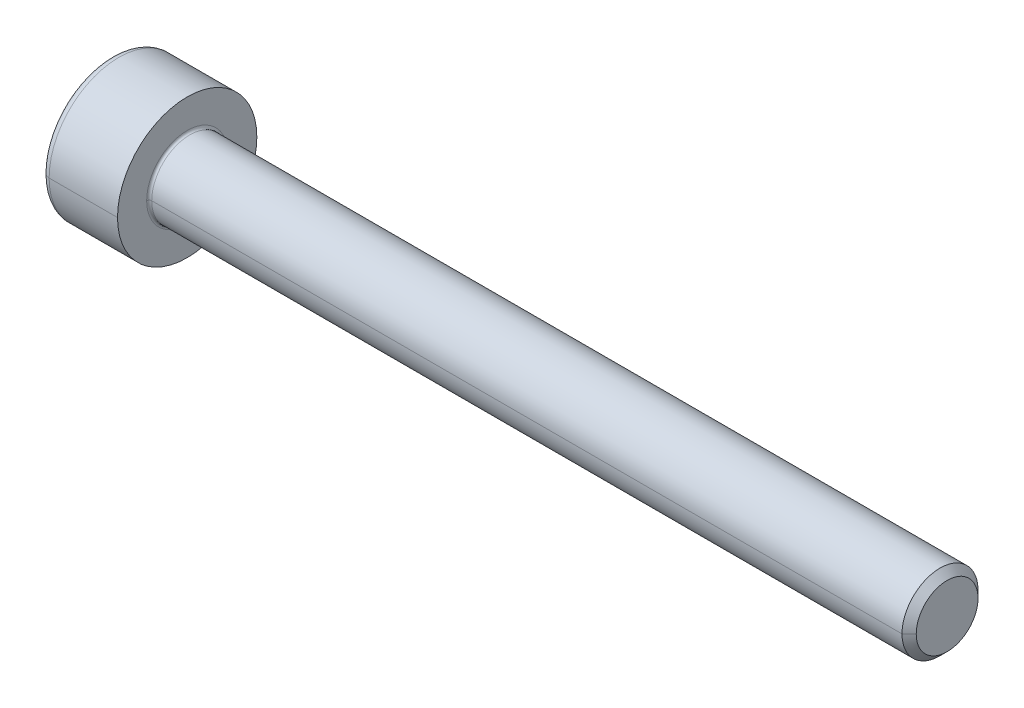
ISO-10303-21;
HEADER;
FILE_DESCRIPTION(('STEP AP214'),'2;1');
FILE_NAME('part.step','',(''),(''),'','','');
FILE_SCHEMA(('AUTOMOTIVE_DESIGN { 1 0 10303 214 1 1 1 1 }'));
ENDSEC;
DATA;
#1=APPLICATION_CONTEXT('core data for automotive mechanical design processes');
#2=APPLICATION_PROTOCOL_DEFINITION('international standard','automotive_design',2000,#1);
#3=PRODUCT_CONTEXT('',#1,'mechanical');
#4=PRODUCT('Part','Part','',(#3));
#5=PRODUCT_RELATED_PRODUCT_CATEGORY('part','',(#4));
#6=PRODUCT_DEFINITION_FORMATION('','',#4);
#7=PRODUCT_DEFINITION_CONTEXT('part definition',#1,'design');
#8=PRODUCT_DEFINITION('design','',#6,#7);
#9=PRODUCT_DEFINITION_SHAPE('','',#8);
#10=(LENGTH_UNIT() NAMED_UNIT(*) SI_UNIT(.MILLI.,.METRE.));
#11=(NAMED_UNIT(*) PLANE_ANGLE_UNIT() SI_UNIT($,.RADIAN.));
#12=(NAMED_UNIT(*) SI_UNIT($,.STERADIAN.) SOLID_ANGLE_UNIT());
#13=UNCERTAINTY_MEASURE_WITH_UNIT(LENGTH_MEASURE(1.E-05),#10,'distance_accuracy_value','');
#14=(GEOMETRIC_REPRESENTATION_CONTEXT(3) GLOBAL_UNCERTAINTY_ASSIGNED_CONTEXT((#13)) GLOBAL_UNIT_ASSIGNED_CONTEXT((#10,
#11,#12)) REPRESENTATION_CONTEXT('',''));
#15=CARTESIAN_POINT('',(0.,0.,0.));
#16=DIRECTION('',(0.,0.,1.));
#17=DIRECTION('',(1.,0.,0.));
#18=AXIS2_PLACEMENT_3D('',#15,#16,#17);
#19=CARTESIAN_POINT('',(1.3,0.,0.));
#20=DIRECTION('',(-1.,0.,0.));
#21=DIRECTION('',(0.,0.,1.));
#22=AXIS2_PLACEMENT_3D('',#19,#20,#21);
#23=CONICAL_SURFACE('',#22,1.26,1.0471975511966);
#24=DIRECTION('',(-0.5,0.,-0.866025403784436));
#25=VECTOR('',#24,1.);
#26=CARTESIAN_POINT('',(1.3,0.,-1.26));
#27=LINE('',#26,#25);
#28=CARTESIAN_POINT('',(2.02746133917893,0.,0.));
#29=VERTEX_POINT('',#28);
#30=CARTESIAN_POINT('',(1.3,0.,-1.26));
#31=VERTEX_POINT('',#30);
#32=EDGE_CURVE('E172',#29,#31,#27,.T.);
#33=ORIENTED_EDGE('',*,*,#32,.F.);
#34=DIRECTION('',(-0.5,0.,0.866025403784436));
#35=VECTOR('',#34,1.);
#36=CARTESIAN_POINT('',(1.3,0.,1.26));
#37=LINE('',#36,#35);
#38=CARTESIAN_POINT('',(1.3,0.,1.26));
#39=VERTEX_POINT('',#38);
#40=EDGE_CURVE('E175',#29,#39,#37,.T.);
#41=ORIENTED_EDGE('',*,*,#40,.T.);
#42=CARTESIAN_POINT('',(1.3,0.,0.));
#43=DIRECTION('',(-1.,0.,0.));
#44=DIRECTION('',(0.,0.,1.));
#45=AXIS2_PLACEMENT_3D('',#42,#43,#44);
#46=CIRCLE('',#45,1.26);
#47=CARTESIAN_POINT('',(1.3,1.09119200876839,0.63));
#48=VERTEX_POINT('',#47);
#49=EDGE_CURVE('E359',#39,#48,#46,.T.);
#50=ORIENTED_EDGE('',*,*,#49,.T.);
#51=CARTESIAN_POINT('',(1.3,0.,0.));
#52=DIRECTION('',(-1.,0.,0.));
#53=DIRECTION('',(0.,0.,1.));
#54=AXIS2_PLACEMENT_3D('',#51,#52,#53);
#55=CIRCLE('',#54,1.26);
#56=CARTESIAN_POINT('',(1.3,1.09119200876839,-0.63));
#57=VERTEX_POINT('',#56);
#58=EDGE_CURVE('E25',#48,#57,#55,.T.);
#59=ORIENTED_EDGE('',*,*,#58,.T.);
#60=CARTESIAN_POINT('',(1.3,0.,0.));
#61=DIRECTION('',(-1.,0.,0.));
#62=DIRECTION('',(0.,0.,1.));
#63=AXIS2_PLACEMENT_3D('',#60,#61,#62);
#64=CIRCLE('',#63,1.26);
#65=EDGE_CURVE('E11',#57,#31,#64,.T.);
#66=ORIENTED_EDGE('',*,*,#65,.T.);
#67=EDGE_LOOP('',(#33,#41,#50,#59,#66));
#68=FACE_BOUND('',#67,.T.);
#69=ADVANCED_FACE('F17',(#68),#23,.F.);
#70=CARTESIAN_POINT('',(1.3,1.45492267835785,0.));
#71=DIRECTION('',(1.,0.,0.));
#72=DIRECTION('',(0.,1.,0.));
#73=AXIS2_PLACEMENT_3D('',#70,#71,#72);
#74=PLANE('',#73);
#75=DIRECTION('',(0.,-0.5,-0.866025403784438));
#76=VECTOR('',#75,1.);
#77=CARTESIAN_POINT('',(1.3,1.45492267835785,0.));
#78=LINE('',#77,#76);
#79=CARTESIAN_POINT('',(1.3,0.727461339178922,-1.26));
#80=VERTEX_POINT('',#79);
#81=EDGE_CURVE('E43',#57,#80,#78,.T.);
#82=ORIENTED_EDGE('',*,*,#81,.T.);
#83=DIRECTION('',(0.,-1.,0.));
#84=VECTOR('',#83,1.);
#85=CARTESIAN_POINT('',(1.3,0.727461339178922,-1.26));
#86=LINE('',#85,#84);
#87=EDGE_CURVE('E288',#80,#31,#86,.T.);
#88=ORIENTED_EDGE('',*,*,#87,.T.);
#89=ORIENTED_EDGE('',*,*,#65,.F.);
#90=EDGE_LOOP('',(#82,#88,#89));
#91=FACE_BOUND('',#90,.T.);
#92=ADVANCED_FACE('F380',(#91),#74,.F.);
#93=CARTESIAN_POINT('',(1.3,1.45492267835785,0.));
#94=DIRECTION('',(1.,0.,0.));
#95=DIRECTION('',(0.,1.,0.));
#96=AXIS2_PLACEMENT_3D('',#93,#94,#95);
#97=PLANE('',#96);
#98=DIRECTION('',(0.,-0.5,0.866025403784439));
#99=VECTOR('',#98,1.);
#100=CARTESIAN_POINT('',(1.3,1.45492267835785,0.));
#101=LINE('',#100,#99);
#102=CARTESIAN_POINT('',(1.3,1.45492267835785,0.));
#103=VERTEX_POINT('',#102);
#104=EDGE_CURVE('E313',#103,#48,#101,.T.);
#105=ORIENTED_EDGE('',*,*,#104,.F.);
#106=DIRECTION('',(0.,-0.5,-0.866025403784438));
#107=VECTOR('',#106,1.);
#108=CARTESIAN_POINT('',(1.3,1.45492267835785,0.));
#109=LINE('',#108,#107);
#110=EDGE_CURVE('E228',#103,#57,#109,.T.);
#111=ORIENTED_EDGE('',*,*,#110,.T.);
#112=ORIENTED_EDGE('',*,*,#58,.F.);
#113=EDGE_LOOP('',(#105,#111,#112));
#114=FACE_BOUND('',#113,.T.);
#115=ADVANCED_FACE('F367',(#114),#97,.F.);
#116=CARTESIAN_POINT('',(1.3,1.45492267835785,0.));
#117=DIRECTION('',(1.,0.,0.));
#118=DIRECTION('',(0.,1.,0.));
#119=AXIS2_PLACEMENT_3D('',#116,#117,#118);
#120=PLANE('',#119);
#121=DIRECTION('',(0.,1.,0.));
#122=VECTOR('',#121,1.);
#123=CARTESIAN_POINT('',(1.3,-0.727461339178933,1.26));
#124=LINE('',#123,#122);
#125=CARTESIAN_POINT('',(1.3,0.727461339178925,1.26));
#126=VERTEX_POINT('',#125);
#127=EDGE_CURVE('E324',#39,#126,#124,.T.);
#128=ORIENTED_EDGE('',*,*,#127,.T.);
#129=DIRECTION('',(0.,-0.5,0.866025403784439));
#130=VECTOR('',#129,1.);
#131=CARTESIAN_POINT('',(1.3,1.45492267835785,0.));
#132=LINE('',#131,#130);
#133=EDGE_CURVE('E317',#48,#126,#132,.T.);
#134=ORIENTED_EDGE('',*,*,#133,.F.);
#135=ORIENTED_EDGE('',*,*,#49,.F.);
#136=EDGE_LOOP('',(#128,#134,#135));
#137=FACE_BOUND('',#136,.T.);
#138=ADVANCED_FACE('F388',(#137),#120,.F.);
#139=CARTESIAN_POINT('',(1.3,1.45492267835785,0.));
#140=DIRECTION('',(1.,0.,0.));
#141=DIRECTION('',(0.,1.,0.));
#142=AXIS2_PLACEMENT_3D('',#139,#140,#141);
#143=PLANE('',#142);
#144=DIRECTION('',(0.,-0.5,-0.866025403784438));
#145=VECTOR('',#144,1.);
#146=CARTESIAN_POINT('',(1.3,-0.727461339178933,1.26));
#147=LINE('',#146,#145);
#148=CARTESIAN_POINT('',(1.3,-0.727461339178933,1.26));
#149=VERTEX_POINT('',#148);
#150=CARTESIAN_POINT('',(1.3,-1.0911920087684,0.63));
#151=VERTEX_POINT('',#150);
#152=EDGE_CURVE('E233',#149,#151,#147,.T.);
#153=ORIENTED_EDGE('',*,*,#152,.F.);
#154=DIRECTION('',(0.,1.,0.));
#155=VECTOR('',#154,1.);
#156=CARTESIAN_POINT('',(1.3,-0.727461339178933,1.26));
#157=LINE('',#156,#155);
#158=EDGE_CURVE('E234',#149,#39,#157,.T.);
#159=ORIENTED_EDGE('',*,*,#158,.T.);
#160=CARTESIAN_POINT('',(1.3,0.,0.));
#161=DIRECTION('',(-1.,0.,0.));
#162=DIRECTION('',(0.,0.,1.));
#163=AXIS2_PLACEMENT_3D('',#160,#161,#162);
#164=CIRCLE('',#163,1.26);
#165=EDGE_CURVE('E185',#151,#39,#164,.T.);
#166=ORIENTED_EDGE('',*,*,#165,.F.);
#167=EDGE_LOOP('',(#153,#159,#166));
#168=FACE_BOUND('',#167,.T.);
#169=ADVANCED_FACE('F423',(#168),#143,.F.);
#170=CARTESIAN_POINT('',(1.3,1.45492267835785,0.));
#171=DIRECTION('',(1.,0.,0.));
#172=DIRECTION('',(0.,1.,0.));
#173=AXIS2_PLACEMENT_3D('',#170,#171,#172);
#174=PLANE('',#173);
#175=DIRECTION('',(0.,0.5,-0.866025403784439));
#176=VECTOR('',#175,1.);
#177=CARTESIAN_POINT('',(1.3,-1.45492267835786,0.));
#178=LINE('',#177,#176);
#179=CARTESIAN_POINT('',(1.3,-1.45492267835786,0.));
#180=VERTEX_POINT('',#179);
#181=CARTESIAN_POINT('',(1.3,-1.0911920087684,-0.63));
#182=VERTEX_POINT('',#181);
#183=EDGE_CURVE('E345',#180,#182,#178,.T.);
#184=ORIENTED_EDGE('',*,*,#183,.F.);
#185=DIRECTION('',(0.,-0.5,-0.866025403784438));
#186=VECTOR('',#185,1.);
#187=CARTESIAN_POINT('',(1.3,-0.727461339178933,1.26));
#188=LINE('',#187,#186);
#189=EDGE_CURVE('E333',#151,#180,#188,.T.);
#190=ORIENTED_EDGE('',*,*,#189,.F.);
#191=CARTESIAN_POINT('',(1.3,0.,0.));
#192=DIRECTION('',(-1.,0.,0.));
#193=DIRECTION('',(0.,0.,1.));
#194=AXIS2_PLACEMENT_3D('',#191,#192,#193);
#195=CIRCLE('',#194,1.26);
#196=EDGE_CURVE('E209',#182,#151,#195,.T.);
#197=ORIENTED_EDGE('',*,*,#196,.F.);
#198=EDGE_LOOP('',(#184,#190,#197));
#199=FACE_BOUND('',#198,.T.);
#200=ADVANCED_FACE('F419',(#199),#174,.F.);
#201=CARTESIAN_POINT('',(1.3,1.45492267835785,0.));
#202=DIRECTION('',(1.,0.,0.));
#203=DIRECTION('',(0.,1.,0.));
#204=AXIS2_PLACEMENT_3D('',#201,#202,#203);
#205=PLANE('',#204);
#206=DIRECTION('',(0.,-1.,0.));
#207=VECTOR('',#206,1.);
#208=CARTESIAN_POINT('',(1.3,0.727461339178922,-1.26));
#209=LINE('',#208,#207);
#210=CARTESIAN_POINT('',(1.3,-0.727461339178936,-1.26));
#211=VERTEX_POINT('',#210);
#212=EDGE_CURVE('E337',#31,#211,#209,.T.);
#213=ORIENTED_EDGE('',*,*,#212,.T.);
#214=DIRECTION('',(0.,0.5,-0.866025403784439));
#215=VECTOR('',#214,1.);
#216=CARTESIAN_POINT('',(1.3,-1.45492267835786,0.));
#217=LINE('',#216,#215);
#218=EDGE_CURVE('E338',#182,#211,#217,.T.);
#219=ORIENTED_EDGE('',*,*,#218,.F.);
#220=CARTESIAN_POINT('',(1.3,0.,0.));
#221=DIRECTION('',(-1.,0.,0.));
#222=DIRECTION('',(0.,0.,1.));
#223=AXIS2_PLACEMENT_3D('',#220,#221,#222);
#224=CIRCLE('',#223,1.26);
#225=EDGE_CURVE('E179',#31,#182,#224,.T.);
#226=ORIENTED_EDGE('',*,*,#225,.F.);
#227=EDGE_LOOP('',(#213,#219,#226));
#228=FACE_BOUND('',#227,.T.);
#229=ADVANCED_FACE('F422',(#228),#205,.F.);
#230=CARTESIAN_POINT('',(1.3,1.45492267835785,0.));
#231=DIRECTION('',(0.,0.866025403784438,-0.5));
#232=DIRECTION('',(-1.,0.,0.));
#233=AXIS2_PLACEMENT_3D('',#230,#231,#232);
#234=PLANE('',#233);
#235=DIRECTION('',(0.,-0.5,-0.866025403784438));
#236=VECTOR('',#235,1.);
#237=CARTESIAN_POINT('',(0.,1.45492267835785,0.));
#238=LINE('',#237,#236);
#239=CARTESIAN_POINT('',(0.,1.45492267835785,0.));
#240=VERTEX_POINT('',#239);
#241=CARTESIAN_POINT('',(0.,0.727461339178922,-1.26));
#242=VERTEX_POINT('',#241);
#243=EDGE_CURVE('E294',#240,#242,#238,.T.);
#244=ORIENTED_EDGE('',*,*,#243,.T.);
#245=DIRECTION('',(-1.,0.,0.));
#246=VECTOR('',#245,1.);
#247=CARTESIAN_POINT('',(1.3,0.727461339178922,-1.26));
#248=LINE('',#247,#246);
#249=EDGE_CURVE('E229',#80,#242,#248,.T.);
#250=ORIENTED_EDGE('',*,*,#249,.F.);
#251=ORIENTED_EDGE('',*,*,#81,.F.);
#252=ORIENTED_EDGE('',*,*,#110,.F.);
#253=DIRECTION('',(-1.,0.,0.));
#254=VECTOR('',#253,1.);
#255=CARTESIAN_POINT('',(1.3,1.45492267835785,0.));
#256=LINE('',#255,#254);
#257=EDGE_CURVE('E310',#103,#240,#256,.T.);
#258=ORIENTED_EDGE('',*,*,#257,.T.);
#259=EDGE_LOOP('',(#244,#250,#251,#252,#258));
#260=FACE_BOUND('',#259,.T.);
#261=ADVANCED_FACE('F370',(#260),#234,.F.);
#262=CARTESIAN_POINT('',(1.3,0.727461339178922,-1.26));
#263=DIRECTION('',(0.,0.,-1.));
#264=DIRECTION('',(0.,-1.,0.));
#265=AXIS2_PLACEMENT_3D('',#262,#263,#264);
#266=PLANE('',#265);
#267=DIRECTION('',(0.,-1.,0.));
#268=VECTOR('',#267,1.);
#269=CARTESIAN_POINT('',(0.,0.727461339178922,-1.26));
#270=LINE('',#269,#268);
#271=CARTESIAN_POINT('',(0.,-0.727461339178936,-1.26));
#272=VERTEX_POINT('',#271);
#273=EDGE_CURVE('E293',#242,#272,#270,.T.);
#274=ORIENTED_EDGE('',*,*,#273,.T.);
#275=DIRECTION('',(-1.,0.,0.));
#276=VECTOR('',#275,1.);
#277=CARTESIAN_POINT('',(1.3,-0.727461339178936,-1.26));
#278=LINE('',#277,#276);
#279=EDGE_CURVE('E334',#211,#272,#278,.T.);
#280=ORIENTED_EDGE('',*,*,#279,.F.);
#281=ORIENTED_EDGE('',*,*,#212,.F.);
#282=ORIENTED_EDGE('',*,*,#87,.F.);
#283=ORIENTED_EDGE('',*,*,#249,.T.);
#284=EDGE_LOOP('',(#274,#280,#281,#282,#283));
#285=FACE_BOUND('',#284,.T.);
#286=ADVANCED_FACE('F377',(#285),#266,.F.);
#287=CARTESIAN_POINT('',(1.3,-1.45492267835786,0.));
#288=DIRECTION('',(0.,0.866025403784439,0.5));
#289=DIRECTION('',(1.,0.,0.));
#290=AXIS2_PLACEMENT_3D('',#287,#288,#289);
#291=PLANE('',#290);
#292=DIRECTION('',(0.,0.5,-0.866025403784439));
#293=VECTOR('',#292,1.);
#294=CARTESIAN_POINT('',(0.,-1.45492267835786,0.));
#295=LINE('',#294,#293);
#296=CARTESIAN_POINT('',(0.,-1.45492267835786,0.));
#297=VERTEX_POINT('',#296);
#298=EDGE_CURVE('E289',#297,#272,#295,.T.);
#299=ORIENTED_EDGE('',*,*,#298,.F.);
#300=DIRECTION('',(-1.,0.,0.));
#301=VECTOR('',#300,1.);
#302=CARTESIAN_POINT('',(1.3,-1.45492267835786,0.));
#303=LINE('',#302,#301);
#304=EDGE_CURVE('E342',#180,#297,#303,.T.);
#305=ORIENTED_EDGE('',*,*,#304,.F.);
#306=ORIENTED_EDGE('',*,*,#183,.T.);
#307=ORIENTED_EDGE('',*,*,#218,.T.);
#308=ORIENTED_EDGE('',*,*,#279,.T.);
#309=EDGE_LOOP('',(#299,#305,#306,#307,#308));
#310=FACE_BOUND('',#309,.T.);
#311=ADVANCED_FACE('F412',(#310),#291,.T.);
#312=CARTESIAN_POINT('',(1.3,-0.727461339178933,1.26));
#313=DIRECTION('',(0.,0.866025403784438,-0.5));
#314=DIRECTION('',(-1.,0.,0.));
#315=AXIS2_PLACEMENT_3D('',#312,#313,#314);
#316=PLANE('',#315);
#317=DIRECTION('',(0.,-0.5,-0.866025403784438));
#318=VECTOR('',#317,1.);
#319=CARTESIAN_POINT('',(0.,-0.727461339178933,1.26));
#320=LINE('',#319,#318);
#321=CARTESIAN_POINT('',(0.,-0.727461339178933,1.26));
#322=VERTEX_POINT('',#321);
#323=EDGE_CURVE('E199',#322,#297,#320,.T.);
#324=ORIENTED_EDGE('',*,*,#323,.F.);
#325=DIRECTION('',(-1.,0.,0.));
#326=VECTOR('',#325,1.);
#327=CARTESIAN_POINT('',(1.3,-0.727461339178933,1.26));
#328=LINE('',#327,#326);
#329=EDGE_CURVE('E230',#149,#322,#328,.T.);
#330=ORIENTED_EDGE('',*,*,#329,.F.);
#331=ORIENTED_EDGE('',*,*,#152,.T.);
#332=ORIENTED_EDGE('',*,*,#189,.T.);
#333=ORIENTED_EDGE('',*,*,#304,.T.);
#334=EDGE_LOOP('',(#324,#330,#331,#332,#333));
#335=FACE_BOUND('',#334,.T.);
#336=ADVANCED_FACE('F408',(#335),#316,.T.);
#337=CARTESIAN_POINT('',(1.3,-0.727461339178933,1.26));
#338=DIRECTION('',(0.,0.,1.));
#339=DIRECTION('',(0.,-1.,0.));
#340=AXIS2_PLACEMENT_3D('',#337,#338,#339);
#341=PLANE('',#340);
#342=DIRECTION('',(0.,1.,0.));
#343=VECTOR('',#342,1.);
#344=CARTESIAN_POINT('',(0.,-0.727461339178933,1.26));
#345=LINE('',#344,#343);
#346=CARTESIAN_POINT('',(0.,0.727461339178925,1.26));
#347=VERTEX_POINT('',#346);
#348=EDGE_CURVE('E195',#322,#347,#345,.T.);
#349=ORIENTED_EDGE('',*,*,#348,.T.);
#350=DIRECTION('',(-1.,0.,0.));
#351=VECTOR('',#350,1.);
#352=CARTESIAN_POINT('',(1.3,0.727461339178925,1.26));
#353=LINE('',#352,#351);
#354=EDGE_CURVE('E321',#126,#347,#353,.T.);
#355=ORIENTED_EDGE('',*,*,#354,.F.);
#356=ORIENTED_EDGE('',*,*,#127,.F.);
#357=ORIENTED_EDGE('',*,*,#158,.F.);
#358=ORIENTED_EDGE('',*,*,#329,.T.);
#359=EDGE_LOOP('',(#349,#355,#356,#357,#358));
#360=FACE_BOUND('',#359,.T.);
#361=ADVANCED_FACE('F405',(#360),#341,.F.);
#362=CARTESIAN_POINT('',(1.3,1.45492267835785,0.));
#363=DIRECTION('',(0.,-0.866025403784439,-0.5));
#364=DIRECTION('',(0.,0.5,-0.866025403784439));
#365=AXIS2_PLACEMENT_3D('',#362,#363,#364);
#366=PLANE('',#365);
#367=DIRECTION('',(0.,-0.5,0.866025403784439));
#368=VECTOR('',#367,1.);
#369=CARTESIAN_POINT('',(0.,1.45492267835785,0.));
#370=LINE('',#369,#368);
#371=EDGE_CURVE('E200',#240,#347,#370,.T.);
#372=ORIENTED_EDGE('',*,*,#371,.F.);
#373=ORIENTED_EDGE('',*,*,#257,.F.);
#374=ORIENTED_EDGE('',*,*,#104,.T.);
#375=ORIENTED_EDGE('',*,*,#133,.T.);
#376=ORIENTED_EDGE('',*,*,#354,.T.);
#377=EDGE_LOOP('',(#372,#373,#374,#375,#376));
#378=FACE_BOUND('',#377,.T.);
#379=ADVANCED_FACE('F391',(#378),#366,.T.);
#380=CARTESIAN_POINT('',(0.3,0.,0.));
#381=DIRECTION('',(-1.,0.,0.));
#382=DIRECTION('',(0.,0.,1.));
#383=AXIS2_PLACEMENT_3D('',#380,#381,#382);
#384=TOROIDAL_SURFACE('',#383,2.45,0.3);
#385=CARTESIAN_POINT('',(0.3,0.,-2.45));
#386=DIRECTION('',(0.,1.,0.));
#387=DIRECTION('',(0.,0.,1.));
#388=AXIS2_PLACEMENT_3D('',#385,#386,#387);
#389=CIRCLE('',#388,0.3);
#390=CARTESIAN_POINT('',(0.3,0.,-2.75));
#391=VERTEX_POINT('',#390);
#392=CARTESIAN_POINT('',(0.,0.,-2.45));
#393=VERTEX_POINT('',#392);
#394=EDGE_CURVE('E210',#391,#393,#389,.T.);
#395=ORIENTED_EDGE('',*,*,#394,.F.);
#396=CARTESIAN_POINT('',(0.3,0.,0.));
#397=DIRECTION('',(1.,0.,0.));
#398=DIRECTION('',(0.,0.,1.));
#399=AXIS2_PLACEMENT_3D('',#396,#397,#398);
#400=CIRCLE('',#399,2.75);
#401=CARTESIAN_POINT('',(0.3,0.,2.75));
#402=VERTEX_POINT('',#401);
#403=EDGE_CURVE('E301',#402,#391,#400,.T.);
#404=ORIENTED_EDGE('',*,*,#403,.F.);
#405=CARTESIAN_POINT('',(0.3,0.,2.45));
#406=DIRECTION('',(0.,-1.,0.));
#407=DIRECTION('',(0.,0.,-1.));
#408=AXIS2_PLACEMENT_3D('',#405,#406,#407);
#409=CIRCLE('',#408,0.3);
#410=CARTESIAN_POINT('',(0.,0.,2.45));
#411=VERTEX_POINT('',#410);
#412=EDGE_CURVE('E201',#402,#411,#409,.T.);
#413=ORIENTED_EDGE('',*,*,#412,.T.);
#414=CARTESIAN_POINT('',(0.,0.,0.));
#415=DIRECTION('',(-1.,0.,0.));
#416=DIRECTION('',(0.,0.,1.));
#417=AXIS2_PLACEMENT_3D('',#414,#415,#416);
#418=CIRCLE('',#417,2.45);
#419=EDGE_CURVE('E280',#393,#411,#418,.T.);
#420=ORIENTED_EDGE('',*,*,#419,.F.);
#421=EDGE_LOOP('',(#395,#404,#413,#420));
#422=FACE_BOUND('',#421,.T.);
#423=ADVANCED_FACE('F403',(#422),#384,.T.);
#424=CARTESIAN_POINT('',(3.1,0.,0.));
#425=DIRECTION('',(1.,0.,0.));
#426=DIRECTION('',(0.,0.,-1.));
#427=AXIS2_PLACEMENT_3D('',#424,#425,#426);
#428=TOROIDAL_SURFACE('',#427,1.6,0.1);
#429=CARTESIAN_POINT('',(3.1,0.,1.6));
#430=DIRECTION('',(0.,1.,0.));
#431=DIRECTION('',(0.,0.,1.));
#432=AXIS2_PLACEMENT_3D('',#429,#430,#431);
#433=CIRCLE('',#432,0.1);
#434=CARTESIAN_POINT('',(3.1,0.,1.5));
#435=VERTEX_POINT('',#434);
#436=CARTESIAN_POINT('',(3.,0.,1.6));
#437=VERTEX_POINT('',#436);
#438=EDGE_CURVE('E218',#435,#437,#433,.T.);
#439=ORIENTED_EDGE('',*,*,#438,.F.);
#440=CARTESIAN_POINT('',(3.1,0.,0.));
#441=DIRECTION('',(1.,0.,0.));
#442=DIRECTION('',(0.,0.,-1.));
#443=AXIS2_PLACEMENT_3D('',#440,#441,#442);
#444=CIRCLE('',#443,1.5);
#445=CARTESIAN_POINT('',(3.1,0.,-1.5));
#446=VERTEX_POINT('',#445);
#447=EDGE_CURVE('E261',#446,#435,#444,.T.);
#448=ORIENTED_EDGE('',*,*,#447,.F.);
#449=CARTESIAN_POINT('',(3.1,0.,-1.6));
#450=DIRECTION('',(0.,-1.,0.));
#451=DIRECTION('',(0.,0.,-1.));
#452=AXIS2_PLACEMENT_3D('',#449,#450,#451);
#453=CIRCLE('',#452,0.1);
#454=CARTESIAN_POINT('',(3.,0.,-1.6));
#455=VERTEX_POINT('',#454);
#456=EDGE_CURVE('E223',#446,#455,#453,.T.);
#457=ORIENTED_EDGE('',*,*,#456,.T.);
#458=CARTESIAN_POINT('',(3.,0.,0.));
#459=DIRECTION('',(-1.,0.,0.));
#460=DIRECTION('',(0.,0.,-1.));
#461=AXIS2_PLACEMENT_3D('',#458,#459,#460);
#462=CIRCLE('',#461,1.6);
#463=EDGE_CURVE('E192',#437,#455,#462,.T.);
#464=ORIENTED_EDGE('',*,*,#463,.F.);
#465=EDGE_LOOP('',(#439,#448,#457,#464));
#466=FACE_BOUND('',#465,.T.);
#467=ADVANCED_FACE('F399',(#466),#428,.F.);
#468=CARTESIAN_POINT('',(33.,1.2195,0.));
#469=DIRECTION('',(1.,0.,0.));
#470=DIRECTION('',(0.,1.,0.));
#471=AXIS2_PLACEMENT_3D('',#468,#469,#470);
#472=PLANE('',#471);
#473=CARTESIAN_POINT('',(33.,0.,0.));
#474=DIRECTION('',(-1.,0.,0.));
#475=DIRECTION('',(0.,0.,1.));
#476=AXIS2_PLACEMENT_3D('',#473,#474,#475);
#477=CIRCLE('',#476,1.2195);
#478=CARTESIAN_POINT('',(33.,0.,1.2195));
#479=VERTEX_POINT('',#478);
#480=CARTESIAN_POINT('',(33.,0.,-1.2195));
#481=VERTEX_POINT('',#480);
#482=EDGE_CURVE('E244',#479,#481,#477,.T.);
#483=ORIENTED_EDGE('',*,*,#482,.F.);
#484=CARTESIAN_POINT('',(33.,0.,0.));
#485=DIRECTION('',(-1.,0.,0.));
#486=DIRECTION('',(0.,0.,1.));
#487=AXIS2_PLACEMENT_3D('',#484,#485,#486);
#488=CIRCLE('',#487,1.2195);
#489=EDGE_CURVE('E307',#481,#479,#488,.T.);
#490=ORIENTED_EDGE('',*,*,#489,.F.);
#491=EDGE_LOOP('',(#483,#490));
#492=FACE_BOUND('',#491,.T.);
#493=ADVANCED_FACE('F402',(#492),#472,.T.);
#494=CARTESIAN_POINT('',(33.,0.,0.));
#495=DIRECTION('',(-1.,0.,0.));
#496=DIRECTION('',(0.,0.,1.));
#497=AXIS2_PLACEMENT_3D('',#494,#495,#496);
#498=CONICAL_SURFACE('',#497,1.2195,0.785398163397439);
#499=DIRECTION('',(-0.707106781186554,0.,-0.707106781186541));
#500=VECTOR('',#499,1.);
#501=CARTESIAN_POINT('',(33.,0.,-1.2195));
#502=LINE('',#501,#500);
#503=CARTESIAN_POINT('',(32.7195,0.,-1.5));
#504=VERTEX_POINT('',#503);
#505=EDGE_CURVE('E248',#481,#504,#502,.T.);
#506=ORIENTED_EDGE('',*,*,#505,.F.);
#507=ORIENTED_EDGE('',*,*,#489,.T.);
#508=DIRECTION('',(-0.707106781186554,0.,0.707106781186541));
#509=VECTOR('',#508,1.);
#510=CARTESIAN_POINT('',(33.,0.,1.2195));
#511=LINE('',#510,#509);
#512=CARTESIAN_POINT('',(32.7195,0.,1.5));
#513=VERTEX_POINT('',#512);
#514=EDGE_CURVE('E253',#479,#513,#511,.T.);
#515=ORIENTED_EDGE('',*,*,#514,.T.);
#516=CARTESIAN_POINT('',(32.7195,0.,0.));
#517=DIRECTION('',(-1.,0.,0.));
#518=DIRECTION('',(0.,0.,1.));
#519=AXIS2_PLACEMENT_3D('',#516,#517,#518);
#520=CIRCLE('',#519,1.5);
#521=EDGE_CURVE('E304',#504,#513,#520,.T.);
#522=ORIENTED_EDGE('',*,*,#521,.F.);
#523=EDGE_LOOP('',(#506,#507,#515,#522));
#524=FACE_BOUND('',#523,.T.);
#525=ADVANCED_FACE('F480',(#524),#498,.T.);
#526=CARTESIAN_POINT('',(-31.75,0.,0.));
#527=DIRECTION('',(-1.,0.,0.));
#528=DIRECTION('',(0.,0.,1.));
#529=AXIS2_PLACEMENT_3D('',#526,#527,#528);
#530=CYLINDRICAL_SURFACE('',#529,1.5);
#531=DIRECTION('',(-1.,0.,0.));
#532=VECTOR('',#531,1.);
#533=CARTESIAN_POINT('',(-31.75,0.,-1.5));
#534=LINE('',#533,#532);
#535=EDGE_CURVE('E257',#504,#446,#534,.T.);
#536=ORIENTED_EDGE('',*,*,#535,.F.);
#537=ORIENTED_EDGE('',*,*,#521,.T.);
#538=DIRECTION('',(-1.,0.,0.));
#539=VECTOR('',#538,1.);
#540=CARTESIAN_POINT('',(-31.75,0.,1.5));
#541=LINE('',#540,#539);
#542=EDGE_CURVE('E265',#513,#435,#541,.T.);
#543=ORIENTED_EDGE('',*,*,#542,.T.);
#544=CARTESIAN_POINT('',(3.1,0.,0.));
#545=DIRECTION('',(1.,0.,0.));
#546=DIRECTION('',(0.,0.,-1.));
#547=AXIS2_PLACEMENT_3D('',#544,#545,#546);
#548=CIRCLE('',#547,1.5);
#549=EDGE_CURVE('E205',#435,#446,#548,.T.);
#550=ORIENTED_EDGE('',*,*,#549,.T.);
#551=EDGE_LOOP('',(#536,#537,#543,#550));
#552=FACE_BOUND('',#551,.T.);
#553=ADVANCED_FACE('F397',(#552),#530,.T.);
#554=CARTESIAN_POINT('',(3.,2.75,0.));
#555=DIRECTION('',(1.,0.,0.));
#556=DIRECTION('',(0.,1.,0.));
#557=AXIS2_PLACEMENT_3D('',#554,#555,#556);
#558=PLANE('',#557);
#559=CARTESIAN_POINT('',(3.,0.,0.));
#560=DIRECTION('',(-1.,0.,0.));
#561=DIRECTION('',(0.,0.,-1.));
#562=AXIS2_PLACEMENT_3D('',#559,#560,#561);
#563=CIRCLE('',#562,1.6);
#564=EDGE_CURVE('E219',#455,#437,#563,.T.);
#565=ORIENTED_EDGE('',*,*,#564,.T.);
#566=ORIENTED_EDGE('',*,*,#463,.T.);
#567=EDGE_LOOP('',(#565,#566));
#568=FACE_BOUND('',#567,.T.);
#569=CARTESIAN_POINT('',(3.,0.,0.));
#570=DIRECTION('',(-1.,0.,0.));
#571=DIRECTION('',(0.,0.,1.));
#572=AXIS2_PLACEMENT_3D('',#569,#570,#571);
#573=CIRCLE('',#572,2.75);
#574=CARTESIAN_POINT('',(3.,0.,2.75));
#575=VERTEX_POINT('',#574);
#576=CARTESIAN_POINT('',(3.,0.,-2.75));
#577=VERTEX_POINT('',#576);
#578=EDGE_CURVE('E268',#575,#577,#573,.T.);
#579=ORIENTED_EDGE('',*,*,#578,.F.);
#580=CARTESIAN_POINT('',(3.,0.,0.));
#581=DIRECTION('',(-1.,0.,0.));
#582=DIRECTION('',(0.,0.,1.));
#583=AXIS2_PLACEMENT_3D('',#580,#581,#582);
#584=CIRCLE('',#583,2.75);
#585=EDGE_CURVE('E298',#577,#575,#584,.T.);
#586=ORIENTED_EDGE('',*,*,#585,.F.);
#587=EDGE_LOOP('',(#579,#586));
#588=FACE_BOUND('',#587,.T.);
#589=ADVANCED_FACE('F393',(#568,#588),#558,.T.);
#590=CARTESIAN_POINT('',(-31.75,0.,0.));
#591=DIRECTION('',(-1.,0.,0.));
#592=DIRECTION('',(0.,0.,1.));
#593=AXIS2_PLACEMENT_3D('',#590,#591,#592);
#594=CYLINDRICAL_SURFACE('',#593,2.75);
#595=DIRECTION('',(-1.,0.,0.));
#596=VECTOR('',#595,1.);
#597=CARTESIAN_POINT('',(-31.75,0.,-2.75));
#598=LINE('',#597,#596);
#599=EDGE_CURVE('E272',#577,#391,#598,.T.);
#600=ORIENTED_EDGE('',*,*,#599,.F.);
#601=ORIENTED_EDGE('',*,*,#585,.T.);
#602=DIRECTION('',(-1.,0.,0.));
#603=VECTOR('',#602,1.);
#604=CARTESIAN_POINT('',(-31.75,0.,2.75));
#605=LINE('',#604,#603);
#606=EDGE_CURVE('E276',#575,#402,#605,.T.);
#607=ORIENTED_EDGE('',*,*,#606,.T.);
#608=ORIENTED_EDGE('',*,*,#403,.T.);
#609=EDGE_LOOP('',(#600,#601,#607,#608));
#610=FACE_BOUND('',#609,.T.);
#611=ADVANCED_FACE('F396',(#610),#594,.T.);
#612=CARTESIAN_POINT('',(0.,0.,0.));
#613=DIRECTION('',(-1.,0.,0.));
#614=DIRECTION('',(0.,0.,1.));
#615=AXIS2_PLACEMENT_3D('',#612,#613,#614);
#616=PLANE('',#615);
#617=ORIENTED_EDGE('',*,*,#371,.T.);
#618=ORIENTED_EDGE('',*,*,#348,.F.);
#619=ORIENTED_EDGE('',*,*,#323,.T.);
#620=ORIENTED_EDGE('',*,*,#298,.T.);
#621=ORIENTED_EDGE('',*,*,#273,.F.);
#622=ORIENTED_EDGE('',*,*,#243,.F.);
#623=EDGE_LOOP('',(#617,#618,#619,#620,#621,#622));
#624=FACE_BOUND('',#623,.T.);
#625=CARTESIAN_POINT('',(0.,0.,0.));
#626=DIRECTION('',(-1.,0.,0.));
#627=DIRECTION('',(0.,0.,1.));
#628=AXIS2_PLACEMENT_3D('',#625,#626,#627);
#629=CIRCLE('',#628,2.45);
#630=EDGE_CURVE('E206',#411,#393,#629,.T.);
#631=ORIENTED_EDGE('',*,*,#630,.T.);
#632=ORIENTED_EDGE('',*,*,#419,.T.);
#633=EDGE_LOOP('',(#631,#632));
#634=FACE_BOUND('',#633,.T.);
#635=ADVANCED_FACE('F441',(#624,#634),#616,.T.);
#636=CARTESIAN_POINT('',(-31.75,0.,0.));
#637=DIRECTION('',(-1.,0.,0.));
#638=DIRECTION('',(0.,0.,1.));
#639=AXIS2_PLACEMENT_3D('',#636,#637,#638);
#640=CYLINDRICAL_SURFACE('',#639,2.75);
#641=ORIENTED_EDGE('',*,*,#578,.T.);
#642=ORIENTED_EDGE('',*,*,#599,.T.);
#643=CARTESIAN_POINT('',(0.3,0.,0.));
#644=DIRECTION('',(1.,0.,0.));
#645=DIRECTION('',(0.,0.,1.));
#646=AXIS2_PLACEMENT_3D('',#643,#644,#645);
#647=CIRCLE('',#646,2.75);
#648=EDGE_CURVE('E214',#391,#402,#647,.T.);
#649=ORIENTED_EDGE('',*,*,#648,.T.);
#650=ORIENTED_EDGE('',*,*,#606,.F.);
#651=EDGE_LOOP('',(#641,#642,#649,#650));
#652=FACE_BOUND('',#651,.T.);
#653=ADVANCED_FACE('F499',(#652),#640,.T.);
#654=CARTESIAN_POINT('',(-31.75,0.,0.));
#655=DIRECTION('',(-1.,0.,0.));
#656=DIRECTION('',(0.,0.,1.));
#657=AXIS2_PLACEMENT_3D('',#654,#655,#656);
#658=CYLINDRICAL_SURFACE('',#657,1.5);
#659=CARTESIAN_POINT('',(32.7195,0.,0.));
#660=DIRECTION('',(-1.,0.,0.));
#661=DIRECTION('',(0.,0.,1.));
#662=AXIS2_PLACEMENT_3D('',#659,#660,#661);
#663=CIRCLE('',#662,1.5);
#664=EDGE_CURVE('E252',#513,#504,#663,.T.);
#665=ORIENTED_EDGE('',*,*,#664,.T.);
#666=ORIENTED_EDGE('',*,*,#535,.T.);
#667=ORIENTED_EDGE('',*,*,#447,.T.);
#668=ORIENTED_EDGE('',*,*,#542,.F.);
#669=EDGE_LOOP('',(#665,#666,#667,#668));
#670=FACE_BOUND('',#669,.T.);
#671=ADVANCED_FACE('F492',(#670),#658,.T.);
#672=CARTESIAN_POINT('',(33.,0.,0.));
#673=DIRECTION('',(-1.,0.,0.));
#674=DIRECTION('',(0.,0.,1.));
#675=AXIS2_PLACEMENT_3D('',#672,#673,#674);
#676=CONICAL_SURFACE('',#675,1.2195,0.785398163397439);
#677=ORIENTED_EDGE('',*,*,#482,.T.);
#678=ORIENTED_EDGE('',*,*,#505,.T.);
#679=ORIENTED_EDGE('',*,*,#664,.F.);
#680=ORIENTED_EDGE('',*,*,#514,.F.);
#681=EDGE_LOOP('',(#677,#678,#679,#680));
#682=FACE_BOUND('',#681,.T.);
#683=ADVANCED_FACE('F488',(#682),#676,.T.);
#684=CARTESIAN_POINT('',(3.1,0.,0.));
#685=DIRECTION('',(1.,0.,0.));
#686=DIRECTION('',(0.,0.,-1.));
#687=AXIS2_PLACEMENT_3D('',#684,#685,#686);
#688=TOROIDAL_SURFACE('',#687,1.6,0.1);
#689=ORIENTED_EDGE('',*,*,#549,.F.);
#690=ORIENTED_EDGE('',*,*,#438,.T.);
#691=ORIENTED_EDGE('',*,*,#564,.F.);
#692=ORIENTED_EDGE('',*,*,#456,.F.);
#693=EDGE_LOOP('',(#689,#690,#691,#692));
#694=FACE_BOUND('',#693,.T.);
#695=ADVANCED_FACE('F484',(#694),#688,.F.);
#696=CARTESIAN_POINT('',(0.3,0.,0.));
#697=DIRECTION('',(-1.,0.,0.));
#698=DIRECTION('',(0.,0.,1.));
#699=AXIS2_PLACEMENT_3D('',#696,#697,#698);
#700=TOROIDAL_SURFACE('',#699,2.45,0.3);
#701=ORIENTED_EDGE('',*,*,#648,.F.);
#702=ORIENTED_EDGE('',*,*,#394,.T.);
#703=ORIENTED_EDGE('',*,*,#630,.F.);
#704=ORIENTED_EDGE('',*,*,#412,.F.);
#705=EDGE_LOOP('',(#701,#702,#703,#704));
#706=FACE_BOUND('',#705,.T.);
#707=ADVANCED_FACE('F477',(#706),#700,.T.);
#708=CARTESIAN_POINT('',(1.3,0.,0.));
#709=DIRECTION('',(-1.,0.,0.));
#710=DIRECTION('',(0.,0.,1.));
#711=AXIS2_PLACEMENT_3D('',#708,#709,#710);
#712=CONICAL_SURFACE('',#711,1.26,1.0471975511966);
#713=ORIENTED_EDGE('',*,*,#40,.F.);
#714=ORIENTED_EDGE('',*,*,#32,.T.);
#715=ORIENTED_EDGE('',*,*,#225,.T.);
#716=ORIENTED_EDGE('',*,*,#196,.T.);
#717=ORIENTED_EDGE('',*,*,#165,.T.);
#718=EDGE_LOOP('',(#713,#714,#715,#716,#717));
#719=FACE_BOUND('',#718,.T.);
#720=ADVANCED_FACE('F182',(#719),#712,.F.);
#721=CLOSED_SHELL('',(#69,#92,#115,#138,#169,#200,#229,#261,#286,#311,#336,#361,#379,#423,#467,
#493,#525,#553,#589,#611,#635,#653,#671,#683,#695,#707,#720));
#722=MANIFOLD_SOLID_BREP('B1',#721);
#723=ADVANCED_BREP_SHAPE_REPRESENTATION('',(#18,#722),#14);
#724=SHAPE_DEFINITION_REPRESENTATION(#9,#723);
ENDSEC;
END-ISO-10303-21;
